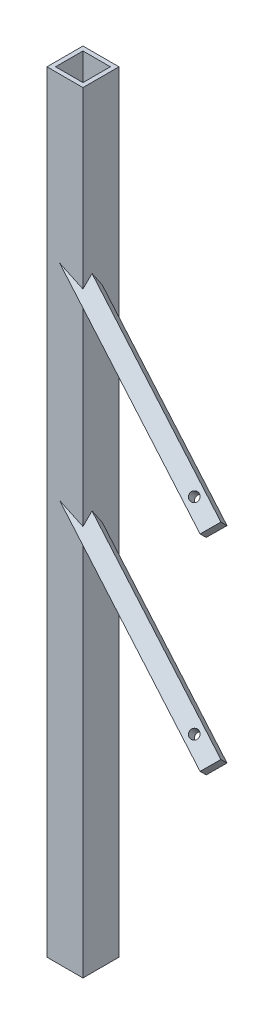
ISO-10303-21;
HEADER;
FILE_DESCRIPTION(('STEP AP214'),'2;1');
FILE_NAME('part.step','',(''),(''),'','','');
FILE_SCHEMA(('AUTOMOTIVE_DESIGN { 1 0 10303 214 1 1 1 1 }'));
ENDSEC;
DATA;
#1=APPLICATION_CONTEXT('core data for automotive mechanical design processes');
#2=APPLICATION_PROTOCOL_DEFINITION('international standard','automotive_design',2000,#1);
#3=PRODUCT_CONTEXT('',#1,'mechanical');
#4=PRODUCT('Part','Part','',(#3));
#5=PRODUCT_RELATED_PRODUCT_CATEGORY('part','',(#4));
#6=PRODUCT_DEFINITION_FORMATION('','',#4);
#7=PRODUCT_DEFINITION_CONTEXT('part definition',#1,'design');
#8=PRODUCT_DEFINITION('design','',#6,#7);
#9=PRODUCT_DEFINITION_SHAPE('','',#8);
#10=(LENGTH_UNIT() NAMED_UNIT(*) SI_UNIT(.MILLI.,.METRE.));
#11=(NAMED_UNIT(*) PLANE_ANGLE_UNIT() SI_UNIT($,.RADIAN.));
#12=(NAMED_UNIT(*) SI_UNIT($,.STERADIAN.) SOLID_ANGLE_UNIT());
#13=UNCERTAINTY_MEASURE_WITH_UNIT(LENGTH_MEASURE(1.E-05),#10,'distance_accuracy_value','');
#14=(GEOMETRIC_REPRESENTATION_CONTEXT(3) GLOBAL_UNCERTAINTY_ASSIGNED_CONTEXT((#13)) GLOBAL_UNIT_ASSIGNED_CONTEXT((#10,
#11,#12)) REPRESENTATION_CONTEXT('',''));
#15=CARTESIAN_POINT('',(0.,0.,0.));
#16=DIRECTION('',(0.,0.,1.));
#17=DIRECTION('',(1.,0.,0.));
#18=AXIS2_PLACEMENT_3D('',#15,#16,#17);
#19=CARTESIAN_POINT('',(10.5,-200.,-10.5));
#20=DIRECTION('',(1.,0.,0.));
#21=DIRECTION('',(0.,0.,-1.));
#22=AXIS2_PLACEMENT_3D('',#19,#20,#21);
#23=PLANE('',#22);
#24=DIRECTION('',(0.,-0.82746415773618,-0.561518537238045));
#25=VECTOR('',#24,1.);
#26=CARTESIAN_POINT('',(10.5,-102.337226268985,-154.417679378864));
#27=LINE('',#26,#25);
#28=CARTESIAN_POINT('',(10.5,140.688532656559,10.5));
#29=VERTEX_POINT('',#28);
#30=CARTESIAN_POINT('',(10.5,136.266639829982,7.49929626124699));
#31=VERTEX_POINT('',#30);
#32=EDGE_CURVE('E308',#29,#31,#27,.T.);
#33=ORIENTED_EDGE('',*,*,#32,.F.);
#34=DIRECTION('',(0.,1.,0.));
#35=VECTOR('',#34,1.);
#36=CARTESIAN_POINT('',(10.5,-200.,10.5));
#37=LINE('',#36,#35);
#38=CARTESIAN_POINT('',(10.5,28.1570167506505,10.5));
#39=VERTEX_POINT('',#38);
#40=EDGE_CURVE('E471',#39,#29,#37,.T.);
#41=ORIENTED_EDGE('',*,*,#40,.F.);
#42=DIRECTION('',(0.,-0.707106781186549,0.707106781186546));
#43=VECTOR('',#42,1.);
#44=CARTESIAN_POINT('',(10.5,-75.4214916246751,114.078508375325));
#45=LINE('',#44,#43);
#46=CARTESIAN_POINT('',(10.5,33.4258612200547,5.23115553059587));
#47=VERTEX_POINT('',#46);
#48=EDGE_CURVE('E379',#47,#39,#45,.T.);
#49=ORIENTED_EDGE('',*,*,#48,.F.);
#50=DIRECTION('',(0.,0.82746415773618,0.561518537238046));
#51=VECTOR('',#50,1.);
#52=CARTESIAN_POINT('',(10.5,-133.709378357699,-108.187092705544));
#53=LINE('',#52,#51);
#54=CARTESIAN_POINT('',(10.5,24.5547388077928,-0.788802716563803));
#55=VERTEX_POINT('',#54);
#56=EDGE_CURVE('E398',#55,#47,#53,.T.);
#57=ORIENTED_EDGE('',*,*,#56,.F.);
#58=DIRECTION('',(0.,-0.707106781186549,0.707106781186546));
#59=VECTOR('',#58,1.);
#60=CARTESIAN_POINT('',(10.5,-82.8670319543858,106.632968045615));
#61=LINE('',#60,#59);
#62=CARTESIAN_POINT('',(10.5,16.266639829982,7.499296261247));
#63=VERTEX_POINT('',#62);
#64=EDGE_CURVE('E395',#55,#63,#61,.T.);
#65=ORIENTED_EDGE('',*,*,#64,.T.);
#66=DIRECTION('',(0.,-0.82746415773618,-0.561518537238045));
#67=VECTOR('',#66,1.);
#68=CARTESIAN_POINT('',(10.5,-140.173594388419,-98.6613037625924));
#69=LINE('',#68,#67);
#70=CARTESIAN_POINT('',(10.5,20.6885326565593,10.5));
#71=VERTEX_POINT('',#70);
#72=EDGE_CURVE('E391',#71,#63,#69,.T.);
#73=ORIENTED_EDGE('',*,*,#72,.F.);
#74=CARTESIAN_POINT('',(10.5,-200.,10.5));
#75=VERTEX_POINT('',#74);
#76=EDGE_CURVE('E466',#75,#71,#37,.T.);
#77=ORIENTED_EDGE('',*,*,#76,.F.);
#78=DIRECTION('',(0.,0.,-1.));
#79=VECTOR('',#78,1.);
#80=CARTESIAN_POINT('',(10.5,-200.,-10.5));
#81=LINE('',#80,#79);
#82=CARTESIAN_POINT('',(10.5,-200.,-10.5));
#83=VERTEX_POINT('',#82);
#84=EDGE_CURVE('E449',#75,#83,#81,.T.);
#85=ORIENTED_EDGE('',*,*,#84,.T.);
#86=DIRECTION('',(0.,1.,0.));
#87=VECTOR('',#86,1.);
#88=CARTESIAN_POINT('',(10.5,-200.,-10.5));
#89=LINE('',#88,#87);
#90=CARTESIAN_POINT('',(10.5,250.,-10.5));
#91=VERTEX_POINT('',#90);
#92=EDGE_CURVE('E465',#83,#91,#89,.T.);
#93=ORIENTED_EDGE('',*,*,#92,.T.);
#94=DIRECTION('',(0.,0.,-1.));
#95=VECTOR('',#94,1.);
#96=CARTESIAN_POINT('',(10.5,250.,-10.5));
#97=LINE('',#96,#95);
#98=CARTESIAN_POINT('',(10.5,250.,10.5));
#99=VERTEX_POINT('',#98);
#100=EDGE_CURVE('E422',#99,#91,#97,.T.);
#101=ORIENTED_EDGE('',*,*,#100,.F.);
#102=CARTESIAN_POINT('',(10.5,148.157016750651,10.5));
#103=VERTEX_POINT('',#102);
#104=EDGE_CURVE('E472',#103,#99,#37,.T.);
#105=ORIENTED_EDGE('',*,*,#104,.F.);
#106=DIRECTION('',(0.,-0.707106781186549,0.707106781186546));
#107=VECTOR('',#106,1.);
#108=CARTESIAN_POINT('',(10.5,-15.4214916246753,174.078508375325));
#109=LINE('',#108,#107);
#110=CARTESIAN_POINT('',(10.5,153.425861220055,5.23115553059586));
#111=VERTEX_POINT('',#110);
#112=EDGE_CURVE('E297',#111,#103,#109,.T.);
#113=ORIENTED_EDGE('',*,*,#112,.F.);
#114=DIRECTION('',(0.,0.82746415773618,0.561518537238046));
#115=VECTOR('',#114,1.);
#116=CARTESIAN_POINT('',(10.5,-95.8730102382644,-163.943468321816));
#117=LINE('',#116,#115);
#118=CARTESIAN_POINT('',(10.5,144.554738807793,-0.788802716563782));
#119=VERTEX_POINT('',#118);
#120=EDGE_CURVE('E59',#119,#111,#117,.T.);
#121=ORIENTED_EDGE('',*,*,#120,.F.);
#122=DIRECTION('',(0.,-0.707106781186549,0.707106781186546));
#123=VECTOR('',#122,1.);
#124=CARTESIAN_POINT('',(10.5,-22.8670319543861,166.632968045615));
#125=LINE('',#124,#123);
#126=EDGE_CURVE('E54',#119,#31,#125,.T.);
#127=ORIENTED_EDGE('',*,*,#126,.T.);
#128=EDGE_LOOP('',(#33,#41,#49,#57,#65,#73,#77,#85,#93,#101,#105,#113,#121,#127));
#129=FACE_BOUND('',#128,.T.);
#130=ADVANCED_FACE('F39',(#129),#23,.T.);
#131=CARTESIAN_POINT('',(-10.5,-200.,10.5));
#132=DIRECTION('',(0.,0.,1.));
#133=DIRECTION('',(1.,0.,0.));
#134=AXIS2_PLACEMENT_3D('',#131,#132,#133);
#135=PLANE('',#134);
#136=DIRECTION('',(0.701585538808347,-0.712585245240878,0.));
#137=VECTOR('',#136,1.);
#138=CARTESIAN_POINT('',(170.48698813864,-21.8067881161014,10.5));
#139=LINE('',#138,#137);
#140=CARTESIAN_POINT('',(-3.09461680554979,154.496290676761,10.5));
#141=VERTEX_POINT('',#140);
#142=EDGE_CURVE('E304',#141,#29,#139,.T.);
#143=ORIENTED_EDGE('',*,*,#142,.F.);
#144=DIRECTION('',(-0.906307787036653,0.422618261740693,0.));
#145=VECTOR('',#144,1.);
#146=CARTESIAN_POINT('',(126.602604105648,94.0174833244499,10.5));
#147=LINE('',#146,#145);
#148=EDGE_CURVE('E293',#103,#141,#147,.T.);
#149=ORIENTED_EDGE('',*,*,#148,.F.);
#150=ORIENTED_EDGE('',*,*,#104,.T.);
#151=DIRECTION('',(1.,0.,0.));
#152=VECTOR('',#151,1.);
#153=CARTESIAN_POINT('',(-10.5,250.,10.5));
#154=LINE('',#153,#152);
#155=CARTESIAN_POINT('',(-10.5,250.,10.5));
#156=VERTEX_POINT('',#155);
#157=EDGE_CURVE('E445',#156,#99,#154,.T.);
#158=ORIENTED_EDGE('',*,*,#157,.F.);
#159=DIRECTION('',(0.,1.,0.));
#160=VECTOR('',#159,1.);
#161=CARTESIAN_POINT('',(-10.5,-200.,10.5));
#162=LINE('',#161,#160);
#163=CARTESIAN_POINT('',(-10.5,-200.,10.5));
#164=VERTEX_POINT('',#163);
#165=EDGE_CURVE('E473',#164,#156,#162,.T.);
#166=ORIENTED_EDGE('',*,*,#165,.F.);
#167=DIRECTION('',(1.,0.,0.));
#168=VECTOR('',#167,1.);
#169=CARTESIAN_POINT('',(-10.5,-200.,10.5));
#170=LINE('',#169,#168);
#171=EDGE_CURVE('E461',#164,#75,#170,.T.);
#172=ORIENTED_EDGE('',*,*,#171,.T.);
#173=ORIENTED_EDGE('',*,*,#76,.T.);
#174=DIRECTION('',(0.701585538808347,-0.712585245240878,0.));
#175=VECTOR('',#174,1.);
#176=CARTESIAN_POINT('',(110.494247751136,-80.8734603079012,10.5));
#177=LINE('',#176,#175);
#178=CARTESIAN_POINT('',(-3.09461680554979,34.4962906767609,10.5));
#179=VERTEX_POINT('',#178);
#180=EDGE_CURVE('E387',#179,#71,#177,.T.);
#181=ORIENTED_EDGE('',*,*,#180,.F.);
#182=DIRECTION('',(-0.906307787036653,0.422618261740693,0.));
#183=VECTOR('',#182,1.);
#184=CARTESIAN_POINT('',(80.6399375185099,-4.54977325674319,10.5));
#185=LINE('',#184,#183);
#186=EDGE_CURVE('E375',#39,#179,#185,.T.);
#187=ORIENTED_EDGE('',*,*,#186,.F.);
#188=ORIENTED_EDGE('',*,*,#40,.T.);
#189=EDGE_LOOP('',(#143,#149,#150,#158,#166,#172,#173,#181,#187,#188));
#190=FACE_BOUND('',#189,.T.);
#191=ADVANCED_FACE('F540',(#190),#135,.T.);
#192=CARTESIAN_POINT('',(-10.5,-200.,-10.5));
#193=DIRECTION('',(-1.,0.,0.));
#194=DIRECTION('',(0.,0.,1.));
#195=AXIS2_PLACEMENT_3D('',#192,#193,#194);
#196=PLANE('',#195);
#197=ORIENTED_EDGE('',*,*,#165,.T.);
#198=DIRECTION('',(0.,0.,1.));
#199=VECTOR('',#198,1.);
#200=CARTESIAN_POINT('',(-10.5,250.,-10.5));
#201=LINE('',#200,#199);
#202=CARTESIAN_POINT('',(-10.5,250.,-10.5));
#203=VERTEX_POINT('',#202);
#204=EDGE_CURVE('E441',#203,#156,#201,.T.);
#205=ORIENTED_EDGE('',*,*,#204,.F.);
#206=DIRECTION('',(0.,1.,0.));
#207=VECTOR('',#206,1.);
#208=CARTESIAN_POINT('',(-10.5,-200.,-10.5));
#209=LINE('',#208,#207);
#210=CARTESIAN_POINT('',(-10.5,-200.,-10.5));
#211=VERTEX_POINT('',#210);
#212=EDGE_CURVE('E476',#211,#203,#209,.T.);
#213=ORIENTED_EDGE('',*,*,#212,.F.);
#214=DIRECTION('',(0.,0.,1.));
#215=VECTOR('',#214,1.);
#216=CARTESIAN_POINT('',(-10.5,-200.,-10.5));
#217=LINE('',#216,#215);
#218=EDGE_CURVE('E457',#211,#164,#217,.T.);
#219=ORIENTED_EDGE('',*,*,#218,.T.);
#220=EDGE_LOOP('',(#197,#205,#213,#219));
#221=FACE_BOUND('',#220,.T.);
#222=ADVANCED_FACE('F560',(#221),#196,.T.);
#223=CARTESIAN_POINT('',(-10.5,-200.,-10.5));
#224=DIRECTION('',(0.,0.,-1.));
#225=DIRECTION('',(-1.,0.,0.));
#226=AXIS2_PLACEMENT_3D('',#223,#224,#225);
#227=PLANE('',#226);
#228=ORIENTED_EDGE('',*,*,#212,.T.);
#229=DIRECTION('',(-1.,0.,0.));
#230=VECTOR('',#229,1.);
#231=CARTESIAN_POINT('',(-10.5,250.,-10.5));
#232=LINE('',#231,#230);
#233=EDGE_CURVE('E437',#91,#203,#232,.T.);
#234=ORIENTED_EDGE('',*,*,#233,.F.);
#235=ORIENTED_EDGE('',*,*,#92,.F.);
#236=DIRECTION('',(-1.,0.,0.));
#237=VECTOR('',#236,1.);
#238=CARTESIAN_POINT('',(-10.5,-200.,-10.5));
#239=LINE('',#238,#237);
#240=EDGE_CURVE('E453',#83,#211,#239,.T.);
#241=ORIENTED_EDGE('',*,*,#240,.T.);
#242=EDGE_LOOP('',(#228,#234,#235,#241));
#243=FACE_BOUND('',#242,.T.);
#244=ADVANCED_FACE('F602',(#243),#227,.T.);
#245=CARTESIAN_POINT('',(0.,-200.,0.));
#246=DIRECTION('',(0.,1.,0.));
#247=DIRECTION('',(0.,0.,1.));
#248=AXIS2_PLACEMENT_3D('',#245,#246,#247);
#249=PLANE('',#248);
#250=DIRECTION('',(-1.,0.,0.));
#251=VECTOR('',#250,1.);
#252=CARTESIAN_POINT('',(-8.,-200.,8.));
#253=LINE('',#252,#251);
#254=CARTESIAN_POINT('',(8.,-200.,8.));
#255=VERTEX_POINT('',#254);
#256=CARTESIAN_POINT('',(-8.,-200.,8.));
#257=VERTEX_POINT('',#256);
#258=EDGE_CURVE('E406',#255,#257,#253,.T.);
#259=ORIENTED_EDGE('',*,*,#258,.F.);
#260=DIRECTION('',(0.,0.,1.));
#261=VECTOR('',#260,1.);
#262=CARTESIAN_POINT('',(8.,-200.,8.));
#263=LINE('',#262,#261);
#264=CARTESIAN_POINT('',(8.,-200.,-8.));
#265=VERTEX_POINT('',#264);
#266=EDGE_CURVE('E402',#265,#255,#263,.T.);
#267=ORIENTED_EDGE('',*,*,#266,.F.);
#268=DIRECTION('',(1.,0.,0.));
#269=VECTOR('',#268,1.);
#270=CARTESIAN_POINT('',(-8.,-200.,-8.));
#271=LINE('',#270,#269);
#272=CARTESIAN_POINT('',(-8.,-200.,-8.));
#273=VERTEX_POINT('',#272);
#274=EDGE_CURVE('E414',#273,#265,#271,.T.);
#275=ORIENTED_EDGE('',*,*,#274,.F.);
#276=DIRECTION('',(0.,0.,-1.));
#277=VECTOR('',#276,1.);
#278=CARTESIAN_POINT('',(-8.,-200.,8.));
#279=LINE('',#278,#277);
#280=EDGE_CURVE('E410',#257,#273,#279,.T.);
#281=ORIENTED_EDGE('',*,*,#280,.F.);
#282=EDGE_LOOP('',(#259,#267,#275,#281));
#283=FACE_BOUND('',#282,.T.);
#284=ORIENTED_EDGE('',*,*,#84,.F.);
#285=ORIENTED_EDGE('',*,*,#171,.F.);
#286=ORIENTED_EDGE('',*,*,#218,.F.);
#287=ORIENTED_EDGE('',*,*,#240,.F.);
#288=EDGE_LOOP('',(#284,#285,#286,#287));
#289=FACE_BOUND('',#288,.T.);
#290=ADVANCED_FACE('F564',(#283,#289),#249,.F.);
#291=CARTESIAN_POINT('',(0.,250.,0.));
#292=DIRECTION('',(0.,1.,0.));
#293=DIRECTION('',(0.,0.,1.));
#294=AXIS2_PLACEMENT_3D('',#291,#292,#293);
#295=PLANE('',#294);
#296=DIRECTION('',(0.,0.,-1.));
#297=VECTOR('',#296,1.);
#298=CARTESIAN_POINT('',(8.,250.,0.));
#299=LINE('',#298,#297);
#300=CARTESIAN_POINT('',(8.,250.,8.));
#301=VERTEX_POINT('',#300);
#302=CARTESIAN_POINT('',(8.,250.,-8.));
#303=VERTEX_POINT('',#302);
#304=EDGE_CURVE('E490',#301,#303,#299,.T.);
#305=ORIENTED_EDGE('',*,*,#304,.F.);
#306=DIRECTION('',(1.,0.,0.));
#307=VECTOR('',#306,1.);
#308=CARTESIAN_POINT('',(0.,250.,8.));
#309=LINE('',#308,#307);
#310=CARTESIAN_POINT('',(-8.,250.,8.));
#311=VERTEX_POINT('',#310);
#312=EDGE_CURVE('E470',#311,#301,#309,.T.);
#313=ORIENTED_EDGE('',*,*,#312,.F.);
#314=DIRECTION('',(0.,0.,1.));
#315=VECTOR('',#314,1.);
#316=CARTESIAN_POINT('',(-8.,250.,0.));
#317=LINE('',#316,#315);
#318=CARTESIAN_POINT('',(-8.,250.,-8.));
#319=VERTEX_POINT('',#318);
#320=EDGE_CURVE('E483',#319,#311,#317,.T.);
#321=ORIENTED_EDGE('',*,*,#320,.F.);
#322=DIRECTION('',(-1.,0.,0.));
#323=VECTOR('',#322,1.);
#324=CARTESIAN_POINT('',(0.,250.,-8.));
#325=LINE('',#324,#323);
#326=EDGE_CURVE('E487',#303,#319,#325,.T.);
#327=ORIENTED_EDGE('',*,*,#326,.F.);
#328=EDGE_LOOP('',(#305,#313,#321,#327));
#329=FACE_BOUND('',#328,.T.);
#330=ORIENTED_EDGE('',*,*,#100,.T.);
#331=ORIENTED_EDGE('',*,*,#233,.T.);
#332=ORIENTED_EDGE('',*,*,#204,.T.);
#333=ORIENTED_EDGE('',*,*,#157,.T.);
#334=EDGE_LOOP('',(#330,#331,#332,#333));
#335=FACE_BOUND('',#334,.T.);
#336=ADVANCED_FACE('F555',(#329,#335),#295,.T.);
#337=CARTESIAN_POINT('',(8.,600.,8.));
#338=DIRECTION('',(1.,0.,0.));
#339=DIRECTION('',(0.,0.,-1.));
#340=AXIS2_PLACEMENT_3D('',#337,#338,#339);
#341=PLANE('',#340);
#342=DIRECTION('',(0.,-1.,0.));
#343=VECTOR('',#342,1.);
#344=CARTESIAN_POINT('',(8.,600.,8.));
#345=LINE('',#344,#343);
#346=CARTESIAN_POINT('',(7.99999999999998,139.543682054816,8.));
#347=VERTEX_POINT('',#346);
#348=CARTESIAN_POINT('',(8.00000000000001,31.822785896038,8.));
#349=VERTEX_POINT('',#348);
#350=EDGE_CURVE('E433',#347,#349,#345,.T.);
#351=ORIENTED_EDGE('',*,*,#350,.F.);
#352=DIRECTION('',(0.,-0.82746415773618,-0.561518537238045));
#353=VECTOR('',#352,1.);
#354=CARTESIAN_POINT('',(7.99999999999995,454.816710427556,221.944795151976));
#355=LINE('',#354,#353);
#356=CARTESIAN_POINT('',(8.00000000000002,137.987638768087,6.94406646852972));
#357=VERTEX_POINT('',#356);
#358=EDGE_CURVE('E301',#347,#357,#355,.T.);
#359=ORIENTED_EDGE('',*,*,#358,.T.);
#360=DIRECTION('',(0.,-0.707106781186549,0.707106781186547));
#361=VECTOR('',#360,1.);
#362=CARTESIAN_POINT('',(8.00000000000005,368.465852618309,-223.534147381692));
#363=LINE('',#362,#361);
#364=CARTESIAN_POINT('',(8.00000000000003,146.275737745897,-1.34403250928107));
#365=VERTEX_POINT('',#364);
#366=EDGE_CURVE('E11',#365,#357,#363,.T.);
#367=ORIENTED_EDGE('',*,*,#366,.F.);
#368=DIRECTION('',(0.,0.82746415773618,0.561518537238046));
#369=VECTOR('',#368,1.);
#370=CARTESIAN_POINT('',(7.99999999999995,461.280926458276,212.419006209024));
#371=LINE('',#370,#369);
#372=CARTESIAN_POINT('',(8.00000000000008,155.146860158159,4.67592573787862));
#373=VERTEX_POINT('',#372);
#374=EDGE_CURVE('E47',#365,#373,#371,.T.);
#375=ORIENTED_EDGE('',*,*,#374,.T.);
#376=DIRECTION('',(0.,-0.707106781186549,0.707106781186547));
#377=VECTOR('',#376,1.);
#378=CARTESIAN_POINT('',(8.00000000000004,375.91139294802,-216.088607051981));
#379=LINE('',#378,#377);
#380=CARTESIAN_POINT('',(8.00000000000001,151.822785896038,8.));
#381=VERTEX_POINT('',#380);
#382=EDGE_CURVE('E284',#373,#381,#379,.T.);
#383=ORIENTED_EDGE('',*,*,#382,.T.);
#384=EDGE_CURVE('E429',#301,#381,#345,.T.);
#385=ORIENTED_EDGE('',*,*,#384,.F.);
#386=ORIENTED_EDGE('',*,*,#304,.T.);
#387=DIRECTION('',(0.,-1.,0.));
#388=VECTOR('',#387,1.);
#389=CARTESIAN_POINT('',(8.,600.,-8.));
#390=LINE('',#389,#388);
#391=EDGE_CURVE('E419',#303,#265,#390,.T.);
#392=ORIENTED_EDGE('',*,*,#391,.T.);
#393=ORIENTED_EDGE('',*,*,#266,.T.);
#394=CARTESIAN_POINT('',(7.99999999999995,19.5436820548163,8.));
#395=VERTEX_POINT('',#394);
#396=EDGE_CURVE('E418',#395,#255,#345,.T.);
#397=ORIENTED_EDGE('',*,*,#396,.F.);
#398=DIRECTION('',(0.,-0.82746415773618,-0.561518537238045));
#399=VECTOR('',#398,1.);
#400=CARTESIAN_POINT('',(7.99999999999994,416.980342308121,277.701170768248));
#401=LINE('',#400,#399);
#402=CARTESIAN_POINT('',(8.00000000000002,17.9876387680867,6.94406646852974));
#403=VERTEX_POINT('',#402);
#404=EDGE_CURVE('E383',#395,#403,#401,.T.);
#405=ORIENTED_EDGE('',*,*,#404,.T.);
#406=DIRECTION('',(0.,-0.707106781186549,0.707106781186547));
#407=VECTOR('',#406,1.);
#408=CARTESIAN_POINT('',(8.00000000000006,308.465852618309,-283.534147381692));
#409=LINE('',#408,#407);
#410=CARTESIAN_POINT('',(8.00000000000003,26.2757377458975,-1.34403250928105));
#411=VERTEX_POINT('',#410);
#412=EDGE_CURVE('E509',#411,#403,#409,.T.);
#413=ORIENTED_EDGE('',*,*,#412,.F.);
#414=DIRECTION('',(0.,0.82746415773618,0.561518537238046));
#415=VECTOR('',#414,1.);
#416=CARTESIAN_POINT('',(7.99999999999994,423.444558338841,268.175381825296));
#417=LINE('',#416,#415);
#418=CARTESIAN_POINT('',(8.00000000000003,35.1468601581594,4.67592573787862));
#419=VERTEX_POINT('',#418);
#420=EDGE_CURVE('E505',#411,#419,#417,.T.);
#421=ORIENTED_EDGE('',*,*,#420,.T.);
#422=DIRECTION('',(0.,-0.707106781186549,0.707106781186547));
#423=VECTOR('',#422,1.);
#424=CARTESIAN_POINT('',(8.00000000000006,315.91139294802,-276.088607051981));
#425=LINE('',#424,#423);
#426=EDGE_CURVE('E362',#419,#349,#425,.T.);
#427=ORIENTED_EDGE('',*,*,#426,.T.);
#428=EDGE_LOOP('',(#351,#359,#367,#375,#383,#385,#386,#392,#393,#397,#405,#413,#421,#427));
#429=FACE_BOUND('',#428,.T.);
#430=ADVANCED_FACE('F524',(#429),#341,.F.);
#431=CARTESIAN_POINT('',(-8.,600.,-8.));
#432=DIRECTION('',(0.,0.,-1.));
#433=DIRECTION('',(-1.,0.,0.));
#434=AXIS2_PLACEMENT_3D('',#431,#432,#433);
#435=PLANE('',#434);
#436=ORIENTED_EDGE('',*,*,#326,.T.);
#437=DIRECTION('',(0.,-1.,0.));
#438=VECTOR('',#437,1.);
#439=CARTESIAN_POINT('',(-8.,600.,-8.));
#440=LINE('',#439,#438);
#441=EDGE_CURVE('E423',#319,#273,#440,.T.);
#442=ORIENTED_EDGE('',*,*,#441,.T.);
#443=ORIENTED_EDGE('',*,*,#274,.T.);
#444=ORIENTED_EDGE('',*,*,#391,.F.);
#445=EDGE_LOOP('',(#436,#442,#443,#444));
#446=FACE_BOUND('',#445,.T.);
#447=ADVANCED_FACE('F627',(#446),#435,.F.);
#448=CARTESIAN_POINT('',(-8.,600.,8.));
#449=DIRECTION('',(-1.,0.,0.));
#450=DIRECTION('',(0.,0.,1.));
#451=AXIS2_PLACEMENT_3D('',#448,#449,#450);
#452=PLANE('',#451);
#453=ORIENTED_EDGE('',*,*,#320,.T.);
#454=DIRECTION('',(0.,-1.,0.));
#455=VECTOR('',#454,1.);
#456=CARTESIAN_POINT('',(-8.,600.,8.));
#457=LINE('',#456,#455);
#458=EDGE_CURVE('E426',#311,#257,#457,.T.);
#459=ORIENTED_EDGE('',*,*,#458,.T.);
#460=ORIENTED_EDGE('',*,*,#280,.T.);
#461=ORIENTED_EDGE('',*,*,#441,.F.);
#462=EDGE_LOOP('',(#453,#459,#460,#461));
#463=FACE_BOUND('',#462,.T.);
#464=ADVANCED_FACE('F631',(#463),#452,.F.);
#465=CARTESIAN_POINT('',(-8.,600.,8.));
#466=DIRECTION('',(0.,0.,1.));
#467=DIRECTION('',(1.,0.,0.));
#468=AXIS2_PLACEMENT_3D('',#465,#466,#467);
#469=PLANE('',#468);
#470=DIRECTION('',(-0.567031873662715,-0.823695850572619,0.));
#471=VECTOR('',#470,1.);
#472=CARTESIAN_POINT('',(203.782653642407,454.208911188962,8.));
#473=LINE('',#472,#471);
#474=CARTESIAN_POINT('',(-1.37151430526213,156.192794785091,8.00000000000004));
#475=VERTEX_POINT('',#474);
#476=CARTESIAN_POINT('',(-4.26038595093725,151.996290676761,7.99999999999999));
#477=VERTEX_POINT('',#476);
#478=EDGE_CURVE('E516',#475,#477,#473,.T.);
#479=ORIENTED_EDGE('',*,*,#478,.T.);
#480=DIRECTION('',(0.701585538808347,-0.712585245240878,0.));
#481=VECTOR('',#480,1.);
#482=CARTESIAN_POINT('',(-230.075859144501,381.35217879574,8.));
#483=LINE('',#482,#481);
#484=EDGE_CURVE('E227',#477,#347,#483,.T.);
#485=ORIENTED_EDGE('',*,*,#484,.T.);
#486=ORIENTED_EDGE('',*,*,#350,.T.);
#487=DIRECTION('',(-0.906307787036653,0.422618261740693,0.));
#488=VECTOR('',#487,1.);
#489=CARTESIAN_POINT('',(-222.766799663071,139.431111826846,8.));
#490=LINE('',#489,#488);
#491=CARTESIAN_POINT('',(-1.37151430526208,36.1927947850907,8.));
#492=VERTEX_POINT('',#491);
#493=EDGE_CURVE('E493',#349,#492,#490,.T.);
#494=ORIENTED_EDGE('',*,*,#493,.T.);
#495=DIRECTION('',(-0.567031873662715,-0.823695850572619,0.));
#496=VECTOR('',#495,1.);
#497=CARTESIAN_POINT('',(259.830069819815,415.625893699028,8.));
#498=LINE('',#497,#496);
#499=CARTESIAN_POINT('',(-4.26038595093729,31.9962906767609,7.99999999999998));
#500=VERTEX_POINT('',#499);
#501=EDGE_CURVE('E497',#492,#500,#498,.T.);
#502=ORIENTED_EDGE('',*,*,#501,.T.);
#503=DIRECTION('',(0.701585538808347,-0.712585245240878,0.));
#504=VECTOR('',#503,1.);
#505=CARTESIAN_POINT('',(-290.068599532005,322.28550660394,8.));
#506=LINE('',#505,#504);
#507=EDGE_CURVE('E501',#500,#395,#506,.T.);
#508=ORIENTED_EDGE('',*,*,#507,.T.);
#509=ORIENTED_EDGE('',*,*,#396,.T.);
#510=ORIENTED_EDGE('',*,*,#258,.T.);
#511=ORIENTED_EDGE('',*,*,#458,.F.);
#512=ORIENTED_EDGE('',*,*,#312,.T.);
#513=ORIENTED_EDGE('',*,*,#384,.T.);
#514=DIRECTION('',(-0.906307787036653,0.422618261740693,0.));
#515=VECTOR('',#514,1.);
#516=CARTESIAN_POINT('',(-176.804133075933,237.998368408039,8.));
#517=LINE('',#516,#515);
#518=EDGE_CURVE('E512',#381,#475,#517,.T.);
#519=ORIENTED_EDGE('',*,*,#518,.T.);
#520=EDGE_LOOP('',(#479,#485,#486,#494,#502,#508,#509,#510,#511,#512,#513,#519));
#521=FACE_BOUND('',#520,.T.);
#522=ADVANCED_FACE('F621',(#521),#469,.F.);
#523=CARTESIAN_POINT('',(-6.22607293569946,27.7808613343827,3.78457065762179));
#524=DIRECTION('',(-0.495414291925492,-0.487766909650802,0.718782387935089));
#525=DIRECTION('',(0.823372133330882,0.,0.567501832643871));
#526=AXIS2_PLACEMENT_3D('',#523,#524,#525);
#527=PLANE('',#526);
#528=ORIENTED_EDGE('',*,*,#404,.F.);
#529=ORIENTED_EDGE('',*,*,#507,.F.);
#530=DIRECTION('',(0.313145613014968,0.671542934237818,0.67154293423782));
#531=VECTOR('',#530,1.);
#532=CARTESIAN_POINT('',(-6.22607293569946,27.7808613343827,3.78457065762179));
#533=LINE('',#532,#531);
#534=CARTESIAN_POINT('',(-6.22607293569946,27.7808613343827,3.78457065762179));
#535=VERTEX_POINT('',#534);
#536=EDGE_CURVE('E343',#535,#500,#533,.T.);
#537=ORIENTED_EDGE('',*,*,#536,.F.);
#538=DIRECTION('',(0.810249655603409,-0.557775518757293,0.179949899331979));
#539=VECTOR('',#538,1.);
#540=CARTESIAN_POINT('',(-6.22607293569946,27.7808613343827,3.78457065762179));
#541=LINE('',#540,#539);
#542=EDGE_CURVE('E330',#535,#403,#541,.T.);
#543=ORIENTED_EDGE('',*,*,#542,.T.);
#544=EDGE_LOOP('',(#528,#529,#537,#543));
#545=FACE_BOUND('',#544,.T.);
#546=ADVANCED_FACE('F591',(#545),#527,.T.);
#547=CARTESIAN_POINT('',(9.15884386972392,19.6412040624898,19.6412040624899));
#548=DIRECTION('',(0.313145613014968,0.671542934237818,0.67154293423782));
#549=DIRECTION('',(0.,-0.707106781186549,0.707106781186546));
#550=AXIS2_PLACEMENT_3D('',#547,#548,#549);
#551=PLANE('',#550);
#552=ORIENTED_EDGE('',*,*,#426,.F.);
#553=DIRECTION('',(-0.810249655603409,0.557775518757293,-0.179949899331979));
#554=VECTOR('',#553,1.);
#555=CARTESIAN_POINT('',(107.191981342148,-33.1368576651791,26.7056630338064));
#556=LINE('',#555,#554);
#557=CARTESIAN_POINT('',(1.85952611370509,39.3739597732689,3.31217612064914));
#558=VERTEX_POINT('',#557);
#559=EDGE_CURVE('E354',#419,#558,#556,.T.);
#560=ORIENTED_EDGE('',*,*,#559,.T.);
#561=DIRECTION('',(-0.495414291925491,-0.487766909650803,0.718782387935089));
#562=VECTOR('',#561,1.);
#563=CARTESIAN_POINT('',(1.85952611370509,39.3739597732689,3.31217612064914));
#564=LINE('',#563,#562);
#565=EDGE_CURVE('E320',#558,#492,#564,.T.);
#566=ORIENTED_EDGE('',*,*,#565,.T.);
#567=ORIENTED_EDGE('',*,*,#493,.F.);
#568=EDGE_LOOP('',(#552,#560,#566,#567));
#569=FACE_BOUND('',#568,.T.);
#570=ADVANCED_FACE('F754',(#569),#551,.T.);
#571=CARTESIAN_POINT('',(-1.27193001644458,32.6585304308907,-3.40325322172906));
#572=DIRECTION('',(-0.81024965560341,0.557775518757292,-0.179949899331978));
#573=DIRECTION('',(-0.567031873662715,-0.823695850572619,0.));
#574=AXIS2_PLACEMENT_3D('',#571,#572,#573);
#575=PLANE('',#574);
#576=ORIENTED_EDGE('',*,*,#501,.F.);
#577=ORIENTED_EDGE('',*,*,#565,.F.);
#578=DIRECTION('',(0.313145613014968,0.671542934237818,0.67154293423782));
#579=VECTOR('',#578,1.);
#580=CARTESIAN_POINT('',(-1.27193001644458,32.6585304308907,-3.40325322172906));
#581=LINE('',#580,#579);
#582=CARTESIAN_POINT('',(-1.27193001644458,32.6585304308907,-3.40325322172906));
#583=VERTEX_POINT('',#582);
#584=EDGE_CURVE('E358',#583,#558,#581,.T.);
#585=ORIENTED_EDGE('',*,*,#584,.F.);
#586=DIRECTION('',(-0.495414291925491,-0.487766909650803,0.718782387935089));
#587=VECTOR('',#586,1.);
#588=CARTESIAN_POINT('',(-1.27193001644458,32.6585304308907,-3.40325322172906));
#589=LINE('',#588,#587);
#590=EDGE_CURVE('E324',#583,#535,#589,.T.);
#591=ORIENTED_EDGE('',*,*,#590,.T.);
#592=ORIENTED_EDGE('',*,*,#536,.T.);
#593=EDGE_LOOP('',(#576,#577,#585,#591,#592));
#594=FACE_BOUND('',#593,.T.);
#595=ADVANCED_FACE('F795',(#594),#575,.T.);
#596=CARTESIAN_POINT('',(6.02738773957424,12.9257747201117,12.9257747201117));
#597=DIRECTION('',(0.313145613014968,0.671542934237818,0.67154293423782));
#598=DIRECTION('',(0.,-0.707106781186549,0.707106781186546));
#599=AXIS2_PLACEMENT_3D('',#596,#597,#598);
#600=PLANE('',#599);
#601=DIRECTION('',(-0.810249655603409,0.557775518757293,-0.179949899331979));
#602=VECTOR('',#601,1.);
#603=CARTESIAN_POINT('',(104.060525211999,-39.8522870075573,19.9902336914282));
#604=LINE('',#603,#602);
#605=EDGE_CURVE('E338',#411,#583,#604,.T.);
#606=ORIENTED_EDGE('',*,*,#605,.F.);
#607=ORIENTED_EDGE('',*,*,#412,.T.);
#608=ORIENTED_EDGE('',*,*,#542,.F.);
#609=ORIENTED_EDGE('',*,*,#590,.F.);
#610=EDGE_LOOP('',(#606,#607,#608,#609));
#611=FACE_BOUND('',#610,.T.);
#612=ADVANCED_FACE('F763',(#611),#600,.F.);
#613=CARTESIAN_POINT('',(104.060525211999,-39.8522870075573,19.9902336914282));
#614=DIRECTION('',(0.495414291925492,0.487766909650803,-0.718782387935089));
#615=DIRECTION('',(-0.823372133330882,0.,-0.567501832643871));
#616=AXIS2_PLACEMENT_3D('',#613,#614,#615);
#617=PLANE('',#616);
#618=ORIENTED_EDGE('',*,*,#420,.F.);
#619=ORIENTED_EDGE('',*,*,#605,.T.);
#620=ORIENTED_EDGE('',*,*,#584,.T.);
#621=ORIENTED_EDGE('',*,*,#559,.F.);
#622=EDGE_LOOP('',(#618,#619,#620,#621));
#623=FACE_BOUND('',#622,.T.);
#624=ADVANCED_FACE('F592',(#623),#617,.T.);
#625=CARTESIAN_POINT('',(104.060525211999,-39.8522870075573,19.9902336914282));
#626=VERTEX_POINT('',#625);
#627=EDGE_CURVE('E339',#626,#55,#604,.T.);
#628=ORIENTED_EDGE('',*,*,#627,.T.);
#629=ORIENTED_EDGE('',*,*,#56,.T.);
#630=CARTESIAN_POINT('',(107.191981342148,-33.1368576651791,26.7056630338064));
#631=VERTEX_POINT('',#630);
#632=EDGE_CURVE('E329',#631,#47,#556,.T.);
#633=ORIENTED_EDGE('',*,*,#632,.F.);
#634=DIRECTION('',(0.313145613014968,0.671542934237818,0.67154293423782));
#635=VECTOR('',#634,1.);
#636=CARTESIAN_POINT('',(104.060525211999,-39.8522870075573,19.9902336914282));
#637=LINE('',#636,#635);
#638=EDGE_CURVE('E363',#626,#631,#637,.T.);
#639=ORIENTED_EDGE('',*,*,#638,.F.);
#640=EDGE_LOOP('',(#628,#629,#633,#639));
#641=FACE_BOUND('',#640,.T.);
#642=ADVANCED_FACE('F576',(#641),#617,.T.);
#643=CARTESIAN_POINT('',(99.1063822927437,-44.7299561040654,27.1780575707791));
#644=DIRECTION('',(0.81024965560341,-0.557775518757292,0.179949899331978));
#645=DIRECTION('',(0.567031873662716,0.823695850572619,0.));
#646=AXIS2_PLACEMENT_3D('',#643,#644,#645);
#647=PLANE('',#646);
#648=DIRECTION('',(0.495414291925491,0.487766909650804,-0.718782387935089));
#649=VECTOR('',#648,1.);
#650=CARTESIAN_POINT('',(102.237838422893,-38.0145267616872,33.8934869131573));
#651=LINE('',#650,#649);
#652=CARTESIAN_POINT('',(102.237838422893,-38.0145267616872,33.8934869131573));
#653=VERTEX_POINT('',#652);
#654=EDGE_CURVE('E350',#653,#631,#651,.T.);
#655=ORIENTED_EDGE('',*,*,#654,.F.);
#656=DIRECTION('',(0.313145613014968,0.671542934237818,0.67154293423782));
#657=VECTOR('',#656,1.);
#658=CARTESIAN_POINT('',(99.1063822927437,-44.7299561040654,27.1780575707791));
#659=LINE('',#658,#657);
#660=CARTESIAN_POINT('',(99.1063822927437,-44.7299561040654,27.1780575707791));
#661=VERTEX_POINT('',#660);
#662=EDGE_CURVE('E366',#661,#653,#659,.T.);
#663=ORIENTED_EDGE('',*,*,#662,.F.);
#664=DIRECTION('',(0.495414291925491,0.487766909650804,-0.718782387935089));
#665=VECTOR('',#664,1.);
#666=CARTESIAN_POINT('',(99.1063822927437,-44.7299561040654,27.1780575707791));
#667=LINE('',#666,#665);
#668=EDGE_CURVE('E334',#661,#626,#667,.T.);
#669=ORIENTED_EDGE('',*,*,#668,.T.);
#670=ORIENTED_EDGE('',*,*,#638,.T.);
#671=EDGE_LOOP('',(#655,#663,#669,#670));
#672=FACE_BOUND('',#671,.T.);
#673=ADVANCED_FACE('F583',(#672),#647,.T.);
#674=ORIENTED_EDGE('',*,*,#180,.T.);
#675=ORIENTED_EDGE('',*,*,#72,.T.);
#676=EDGE_CURVE('E328',#63,#661,#541,.T.);
#677=ORIENTED_EDGE('',*,*,#676,.T.);
#678=ORIENTED_EDGE('',*,*,#662,.T.);
#679=DIRECTION('',(0.810249655603409,-0.557775518757293,0.179949899331979));
#680=VECTOR('',#679,1.);
#681=CARTESIAN_POINT('',(-3.09461680554979,34.4962906767609,10.5));
#682=LINE('',#681,#680);
#683=EDGE_CURVE('E346',#179,#653,#682,.T.);
#684=ORIENTED_EDGE('',*,*,#683,.F.);
#685=EDGE_LOOP('',(#674,#675,#677,#678,#684));
#686=FACE_BOUND('',#685,.T.);
#687=ADVANCED_FACE('F567',(#686),#527,.T.);
#688=ORIENTED_EDGE('',*,*,#64,.F.);
#689=ORIENTED_EDGE('',*,*,#627,.F.);
#690=ORIENTED_EDGE('',*,*,#668,.F.);
#691=ORIENTED_EDGE('',*,*,#676,.F.);
#692=EDGE_LOOP('',(#688,#689,#690,#691));
#693=FACE_BOUND('',#692,.T.);
#694=CARTESIAN_POINT('',(89.4297089183201,-33.924488774452,20.884897141124));
#695=DIRECTION('',(0.313145613014968,0.671542934237818,0.67154293423782));
#696=DIRECTION('',(0.,-0.707106781186549,0.707106781186546));
#697=AXIS2_PLACEMENT_3D('',#694,#695,#696);
#698=CIRCLE('',#697,2.50000000000001);
#699=CARTESIAN_POINT('',(89.4297089183201,-35.6922557274183,22.6526640940904));
#700=VERTEX_POINT('',#699);
#701=EDGE_CURVE('E316',#700,#700,#698,.T.);
#702=ORIENTED_EDGE('',*,*,#701,.T.);
#703=EDGE_LOOP('',(#702));
#704=FACE_BOUND('',#703,.T.);
#705=ADVANCED_FACE('F580',(#693,#704),#600,.F.);
#706=CARTESIAN_POINT('',(92.5611650484697,-27.2090594320738,27.6003264835022));
#707=DIRECTION('',(0.313145613014968,0.671542934237818,0.67154293423782));
#708=DIRECTION('',(0.,-0.707106781186549,0.707106781186546));
#709=AXIS2_PLACEMENT_3D('',#706,#707,#708);
#710=CIRCLE('',#709,2.50000000000001);
#711=CARTESIAN_POINT('',(92.5611650484697,-28.9768263850402,29.3680934364686));
#712=VERTEX_POINT('',#711);
#713=EDGE_CURVE('E315',#712,#712,#710,.T.);
#714=ORIENTED_EDGE('',*,*,#713,.F.);
#715=EDGE_LOOP('',(#714));
#716=FACE_BOUND('',#715,.T.);
#717=ORIENTED_EDGE('',*,*,#632,.T.);
#718=ORIENTED_EDGE('',*,*,#48,.T.);
#719=ORIENTED_EDGE('',*,*,#186,.T.);
#720=ORIENTED_EDGE('',*,*,#683,.T.);
#721=ORIENTED_EDGE('',*,*,#654,.T.);
#722=EDGE_LOOP('',(#717,#718,#719,#720,#721));
#723=FACE_BOUND('',#722,.T.);
#724=ADVANCED_FACE('F572',(#716,#723),#551,.T.);
#725=CARTESIAN_POINT('',(89.4297089183201,-33.924488774452,20.884897141124));
#726=DIRECTION('',(0.313145613014968,0.671542934237818,0.67154293423782));
#727=DIRECTION('',(0.,-0.707106781186549,0.707106781186546));
#728=AXIS2_PLACEMENT_3D('',#725,#726,#727);
#729=CYLINDRICAL_SURFACE('',#728,2.50000000000001);
#730=ORIENTED_EDGE('',*,*,#701,.F.);
#731=EDGE_LOOP('',(#730));
#732=FACE_BOUND('',#731,.T.);
#733=ORIENTED_EDGE('',*,*,#713,.T.);
#734=EDGE_LOOP('',(#733));
#735=FACE_BOUND('',#734,.T.);
#736=ADVANCED_FACE('F662',(#732,#735),#729,.F.);
#737=CARTESIAN_POINT('',(-6.22607293569947,147.780861334383,3.78457065762179));
#738=DIRECTION('',(-0.495414291925492,-0.487766909650802,0.718782387935089));
#739=DIRECTION('',(0.823372133330882,0.,0.567501832643871));
#740=AXIS2_PLACEMENT_3D('',#737,#738,#739);
#741=PLANE('',#740);
#742=ORIENTED_EDGE('',*,*,#358,.F.);
#743=ORIENTED_EDGE('',*,*,#484,.F.);
#744=DIRECTION('',(0.313145613014968,0.671542934237818,0.67154293423782));
#745=VECTOR('',#744,1.);
#746=CARTESIAN_POINT('',(-6.22607293569947,147.780861334383,3.78457065762179));
#747=LINE('',#746,#745);
#748=CARTESIAN_POINT('',(-6.22607293569947,147.780861334383,3.78457065762179));
#749=VERTEX_POINT('',#748);
#750=EDGE_CURVE('E221',#749,#477,#747,.T.);
#751=ORIENTED_EDGE('',*,*,#750,.F.);
#752=DIRECTION('',(0.810249655603409,-0.557775518757293,0.179949899331979));
#753=VECTOR('',#752,1.);
#754=CARTESIAN_POINT('',(-6.22607293569947,147.780861334383,3.78457065762179));
#755=LINE('',#754,#753);
#756=EDGE_CURVE('E224',#749,#357,#755,.T.);
#757=ORIENTED_EDGE('',*,*,#756,.T.);
#758=EDGE_LOOP('',(#742,#743,#751,#757));
#759=FACE_BOUND('',#758,.T.);
#760=ADVANCED_FACE('F223',(#759),#741,.T.);
#761=CARTESIAN_POINT('',(9.15884386972391,139.64120406249,19.6412040624899));
#762=DIRECTION('',(0.313145613014968,0.671542934237818,0.67154293423782));
#763=DIRECTION('',(0.,-0.707106781186549,0.707106781186546));
#764=AXIS2_PLACEMENT_3D('',#761,#762,#763);
#765=PLANE('',#764);
#766=ORIENTED_EDGE('',*,*,#382,.F.);
#767=DIRECTION('',(-0.810249655603409,0.557775518757293,-0.179949899331979));
#768=VECTOR('',#767,1.);
#769=CARTESIAN_POINT('',(107.191981342148,86.8631423348209,26.7056630338064));
#770=LINE('',#769,#768);
#771=CARTESIAN_POINT('',(1.85952611370509,159.373959773269,3.31217612064914));
#772=VERTEX_POINT('',#771);
#773=EDGE_CURVE('E257',#373,#772,#770,.T.);
#774=ORIENTED_EDGE('',*,*,#773,.T.);
#775=DIRECTION('',(-0.495414291925491,-0.487766909650803,0.718782387935089));
#776=VECTOR('',#775,1.);
#777=CARTESIAN_POINT('',(1.85952611370509,159.373959773269,3.31217612064914));
#778=LINE('',#777,#776);
#779=EDGE_CURVE('E270',#772,#475,#778,.T.);
#780=ORIENTED_EDGE('',*,*,#779,.T.);
#781=ORIENTED_EDGE('',*,*,#518,.F.);
#782=EDGE_LOOP('',(#766,#774,#780,#781));
#783=FACE_BOUND('',#782,.T.);
#784=ADVANCED_FACE('F634',(#783),#765,.T.);
#785=CARTESIAN_POINT('',(-1.27193001644458,152.658530430891,-3.40325322172906));
#786=DIRECTION('',(-0.81024965560341,0.557775518757292,-0.179949899331978));
#787=DIRECTION('',(-0.567031873662715,-0.823695850572619,0.));
#788=AXIS2_PLACEMENT_3D('',#785,#786,#787);
#789=PLANE('',#788);
#790=ORIENTED_EDGE('',*,*,#478,.F.);
#791=ORIENTED_EDGE('',*,*,#779,.F.);
#792=DIRECTION('',(0.313145613014968,0.671542934237818,0.67154293423782));
#793=VECTOR('',#792,1.);
#794=CARTESIAN_POINT('',(-1.27193001644458,152.658530430891,-3.40325322172906));
#795=LINE('',#794,#793);
#796=CARTESIAN_POINT('',(-1.27193001644458,152.658530430891,-3.40325322172906));
#797=VERTEX_POINT('',#796);
#798=EDGE_CURVE('E250',#797,#772,#795,.T.);
#799=ORIENTED_EDGE('',*,*,#798,.F.);
#800=DIRECTION('',(-0.495414291925491,-0.487766909650803,0.718782387935089));
#801=VECTOR('',#800,1.);
#802=CARTESIAN_POINT('',(-1.27193001644458,152.658530430891,-3.40325322172906));
#803=LINE('',#802,#801);
#804=EDGE_CURVE('E240',#797,#749,#803,.T.);
#805=ORIENTED_EDGE('',*,*,#804,.T.);
#806=ORIENTED_EDGE('',*,*,#750,.T.);
#807=EDGE_LOOP('',(#790,#791,#799,#805,#806));
#808=FACE_BOUND('',#807,.T.);
#809=ADVANCED_FACE('F247',(#808),#789,.T.);
#810=CARTESIAN_POINT('',(6.02738773957424,132.925774720112,12.9257747201117));
#811=DIRECTION('',(0.313145613014968,0.671542934237818,0.67154293423782));
#812=DIRECTION('',(0.,-0.707106781186549,0.707106781186546));
#813=AXIS2_PLACEMENT_3D('',#810,#811,#812);
#814=PLANE('',#813);
#815=DIRECTION('',(-0.810249655603409,0.557775518757293,-0.179949899331979));
#816=VECTOR('',#815,1.);
#817=CARTESIAN_POINT('',(104.060525211999,80.1477129924427,19.9902336914282));
#818=LINE('',#817,#816);
#819=EDGE_CURVE('E266',#365,#797,#818,.T.);
#820=ORIENTED_EDGE('',*,*,#819,.F.);
#821=ORIENTED_EDGE('',*,*,#366,.T.);
#822=ORIENTED_EDGE('',*,*,#756,.F.);
#823=ORIENTED_EDGE('',*,*,#804,.F.);
#824=EDGE_LOOP('',(#820,#821,#822,#823));
#825=FACE_BOUND('',#824,.T.);
#826=ADVANCED_FACE('F239',(#825),#814,.F.);
#827=CARTESIAN_POINT('',(104.060525211999,80.1477129924427,19.9902336914282));
#828=DIRECTION('',(0.495414291925492,0.487766909650803,-0.718782387935089));
#829=DIRECTION('',(-0.823372133330882,0.,-0.567501832643871));
#830=AXIS2_PLACEMENT_3D('',#827,#828,#829);
#831=PLANE('',#830);
#832=ORIENTED_EDGE('',*,*,#374,.F.);
#833=ORIENTED_EDGE('',*,*,#819,.T.);
#834=ORIENTED_EDGE('',*,*,#798,.T.);
#835=ORIENTED_EDGE('',*,*,#773,.F.);
#836=EDGE_LOOP('',(#832,#833,#834,#835));
#837=FACE_BOUND('',#836,.T.);
#838=ADVANCED_FACE('F528',(#837),#831,.T.);
#839=CARTESIAN_POINT('',(104.060525211999,80.1477129924427,19.9902336914282));
#840=VERTEX_POINT('',#839);
#841=EDGE_CURVE('E234',#840,#119,#818,.T.);
#842=ORIENTED_EDGE('',*,*,#841,.T.);
#843=ORIENTED_EDGE('',*,*,#120,.T.);
#844=CARTESIAN_POINT('',(107.191981342148,86.8631423348209,26.7056630338064));
#845=VERTEX_POINT('',#844);
#846=EDGE_CURVE('E252',#845,#111,#770,.T.);
#847=ORIENTED_EDGE('',*,*,#846,.F.);
#848=DIRECTION('',(0.313145613014968,0.671542934237818,0.67154293423782));
#849=VECTOR('',#848,1.);
#850=CARTESIAN_POINT('',(104.060525211999,80.1477129924427,19.9902336914282));
#851=LINE('',#850,#849);
#852=EDGE_CURVE('E285',#840,#845,#851,.T.);
#853=ORIENTED_EDGE('',*,*,#852,.F.);
#854=EDGE_LOOP('',(#842,#843,#847,#853));
#855=FACE_BOUND('',#854,.T.);
#856=ADVANCED_FACE('F675',(#855),#831,.T.);
#857=CARTESIAN_POINT('',(99.1063822927437,75.2700438959346,27.1780575707791));
#858=DIRECTION('',(0.81024965560341,-0.557775518757292,0.179949899331978));
#859=DIRECTION('',(0.567031873662716,0.823695850572619,0.));
#860=AXIS2_PLACEMENT_3D('',#857,#858,#859);
#861=PLANE('',#860);
#862=DIRECTION('',(0.495414291925491,0.487766909650804,-0.718782387935089));
#863=VECTOR('',#862,1.);
#864=CARTESIAN_POINT('',(102.237838422893,81.9854732383128,33.8934869131573));
#865=LINE('',#864,#863);
#866=CARTESIAN_POINT('',(102.237838422893,81.9854732383128,33.8934869131573));
#867=VERTEX_POINT('',#866);
#868=EDGE_CURVE('E278',#867,#845,#865,.T.);
#869=ORIENTED_EDGE('',*,*,#868,.F.);
#870=DIRECTION('',(0.313145613014968,0.671542934237818,0.67154293423782));
#871=VECTOR('',#870,1.);
#872=CARTESIAN_POINT('',(99.1063822927437,75.2700438959346,27.1780575707791));
#873=LINE('',#872,#871);
#874=CARTESIAN_POINT('',(99.1063822927437,75.2700438959346,27.1780575707791));
#875=VERTEX_POINT('',#874);
#876=EDGE_CURVE('E233',#875,#867,#873,.T.);
#877=ORIENTED_EDGE('',*,*,#876,.F.);
#878=DIRECTION('',(0.495414291925491,0.487766909650804,-0.718782387935089));
#879=VECTOR('',#878,1.);
#880=CARTESIAN_POINT('',(99.1063822927437,75.2700438959346,27.1780575707791));
#881=LINE('',#880,#879);
#882=EDGE_CURVE('E243',#875,#840,#881,.T.);
#883=ORIENTED_EDGE('',*,*,#882,.T.);
#884=ORIENTED_EDGE('',*,*,#852,.T.);
#885=EDGE_LOOP('',(#869,#877,#883,#884));
#886=FACE_BOUND('',#885,.T.);
#887=ADVANCED_FACE('F671',(#886),#861,.T.);
#888=ORIENTED_EDGE('',*,*,#142,.T.);
#889=ORIENTED_EDGE('',*,*,#32,.T.);
#890=EDGE_CURVE('E244',#31,#875,#755,.T.);
#891=ORIENTED_EDGE('',*,*,#890,.T.);
#892=ORIENTED_EDGE('',*,*,#876,.T.);
#893=DIRECTION('',(0.810249655603409,-0.557775518757293,0.179949899331979));
#894=VECTOR('',#893,1.);
#895=CARTESIAN_POINT('',(-3.09461680554979,154.496290676761,10.5));
#896=LINE('',#895,#894);
#897=EDGE_CURVE('E273',#141,#867,#896,.T.);
#898=ORIENTED_EDGE('',*,*,#897,.F.);
#899=EDGE_LOOP('',(#888,#889,#891,#892,#898));
#900=FACE_BOUND('',#899,.T.);
#901=ADVANCED_FACE('F543',(#900),#741,.T.);
#902=ORIENTED_EDGE('',*,*,#126,.F.);
#903=ORIENTED_EDGE('',*,*,#841,.F.);
#904=ORIENTED_EDGE('',*,*,#882,.F.);
#905=ORIENTED_EDGE('',*,*,#890,.F.);
#906=EDGE_LOOP('',(#902,#903,#904,#905));
#907=FACE_BOUND('',#906,.T.);
#908=CARTESIAN_POINT('',(89.4297089183201,86.075511225548,20.884897141124));
#909=DIRECTION('',(0.313145613014968,0.671542934237818,0.67154293423782));
#910=DIRECTION('',(0.,-0.707106781186549,0.707106781186546));
#911=AXIS2_PLACEMENT_3D('',#908,#909,#910);
#912=CIRCLE('',#911,2.50000000000001);
#913=CARTESIAN_POINT('',(89.4297089183201,84.3077442725817,22.6526640940904));
#914=VERTEX_POINT('',#913);
#915=EDGE_CURVE('E274',#914,#914,#912,.T.);
#916=ORIENTED_EDGE('',*,*,#915,.T.);
#917=EDGE_LOOP('',(#916));
#918=FACE_BOUND('',#917,.T.);
#919=ADVANCED_FACE('F645',(#907,#918),#814,.F.);
#920=CARTESIAN_POINT('',(92.5611650484697,92.7909405679262,27.6003264835022));
#921=DIRECTION('',(0.313145613014968,0.671542934237818,0.67154293423782));
#922=DIRECTION('',(0.,-0.707106781186549,0.707106781186546));
#923=AXIS2_PLACEMENT_3D('',#920,#921,#922);
#924=CIRCLE('',#923,2.50000000000001);
#925=CARTESIAN_POINT('',(92.5611650484697,91.0231736149598,29.3680934364686));
#926=VERTEX_POINT('',#925);
#927=EDGE_CURVE('E260',#926,#926,#924,.T.);
#928=ORIENTED_EDGE('',*,*,#927,.F.);
#929=EDGE_LOOP('',(#928));
#930=FACE_BOUND('',#929,.T.);
#931=ORIENTED_EDGE('',*,*,#846,.T.);
#932=ORIENTED_EDGE('',*,*,#112,.T.);
#933=ORIENTED_EDGE('',*,*,#148,.T.);
#934=ORIENTED_EDGE('',*,*,#897,.T.);
#935=ORIENTED_EDGE('',*,*,#868,.T.);
#936=EDGE_LOOP('',(#931,#932,#933,#934,#935));
#937=FACE_BOUND('',#936,.T.);
#938=ADVANCED_FACE('F548',(#930,#937),#765,.T.);
#939=CARTESIAN_POINT('',(89.4297089183201,86.075511225548,20.884897141124));
#940=DIRECTION('',(0.313145613014968,0.671542934237818,0.67154293423782));
#941=DIRECTION('',(0.,-0.707106781186549,0.707106781186546));
#942=AXIS2_PLACEMENT_3D('',#939,#940,#941);
#943=CYLINDRICAL_SURFACE('',#942,2.50000000000001);
#944=ORIENTED_EDGE('',*,*,#915,.F.);
#945=EDGE_LOOP('',(#944));
#946=FACE_BOUND('',#945,.T.);
#947=ORIENTED_EDGE('',*,*,#927,.T.);
#948=EDGE_LOOP('',(#947));
#949=FACE_BOUND('',#948,.T.);
#950=ADVANCED_FACE('F642',(#946,#949),#943,.F.);
#951=CLOSED_SHELL('',(#130,#191,#222,#244,#290,#336,#430,#447,#464,#522,#546,#570,#595,#612,
#624,#642,#673,#687,#705,#724,#736,#760,#784,#809,#826,#838,#856,#887,#901,#919,#938,#950));
#952=MANIFOLD_SOLID_BREP('B2',#951);
#953=ADVANCED_BREP_SHAPE_REPRESENTATION('',(#18,#952),#14);
#954=SHAPE_DEFINITION_REPRESENTATION(#9,#953);
ENDSEC;
END-ISO-10303-21;
